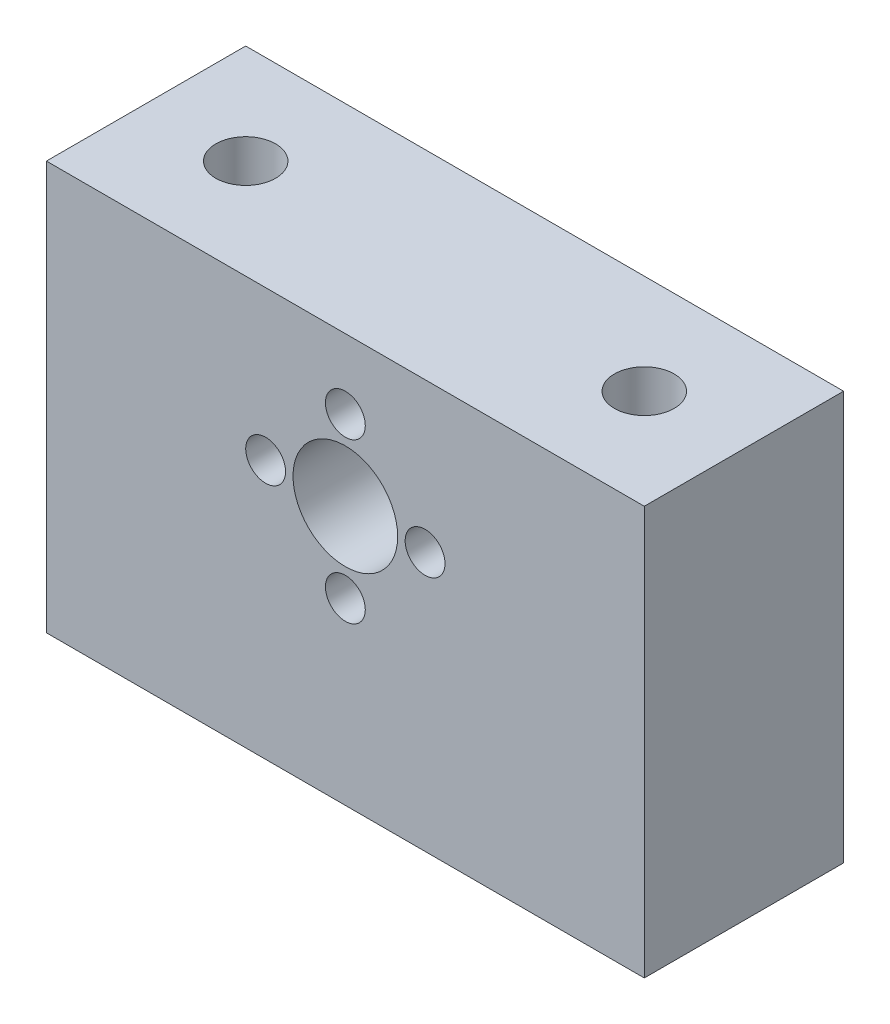
ISO-10303-21;
HEADER;
FILE_DESCRIPTION(('STEP AP214'),'2;1');
FILE_NAME('part.step','',(''),(''),'','','');
FILE_SCHEMA(('AUTOMOTIVE_DESIGN { 1 0 10303 214 1 1 1 1 }'));
ENDSEC;
DATA;
#1=APPLICATION_CONTEXT('core data for automotive mechanical design processes');
#2=APPLICATION_PROTOCOL_DEFINITION('international standard','automotive_design',2000,#1);
#3=PRODUCT_CONTEXT('',#1,'mechanical');
#4=PRODUCT('Part','Part','',(#3));
#5=PRODUCT_RELATED_PRODUCT_CATEGORY('part','',(#4));
#6=PRODUCT_DEFINITION_FORMATION('','',#4);
#7=PRODUCT_DEFINITION_CONTEXT('part definition',#1,'design');
#8=PRODUCT_DEFINITION('design','',#6,#7);
#9=PRODUCT_DEFINITION_SHAPE('','',#8);
#10=(LENGTH_UNIT() NAMED_UNIT(*) SI_UNIT(.MILLI.,.METRE.));
#11=(NAMED_UNIT(*) PLANE_ANGLE_UNIT() SI_UNIT($,.RADIAN.));
#12=(NAMED_UNIT(*) SI_UNIT($,.STERADIAN.) SOLID_ANGLE_UNIT());
#13=UNCERTAINTY_MEASURE_WITH_UNIT(LENGTH_MEASURE(1.E-05),#10,'distance_accuracy_value','');
#14=(GEOMETRIC_REPRESENTATION_CONTEXT(3) GLOBAL_UNCERTAINTY_ASSIGNED_CONTEXT((#13)) GLOBAL_UNIT_ASSIGNED_CONTEXT((#10,
#11,#12)) REPRESENTATION_CONTEXT('',''));
#15=CARTESIAN_POINT('',(0.,0.,0.));
#16=DIRECTION('',(0.,0.,1.));
#17=DIRECTION('',(1.,0.,0.));
#18=AXIS2_PLACEMENT_3D('',#15,#16,#17);
#19=CARTESIAN_POINT('',(0.,0.,20.));
#20=DIRECTION('',(0.,0.,-1.));
#21=DIRECTION('',(-1.,0.,0.));
#22=AXIS2_PLACEMENT_3D('',#19,#20,#21);
#23=PLANE('',#22);
#24=DIRECTION('',(0.,1.,0.));
#25=VECTOR('',#24,1.);
#26=CARTESIAN_POINT('',(30.0000000000366,-26.,20.));
#27=LINE('',#26,#25);
#28=CARTESIAN_POINT('',(30.0000000000366,-26.,20.));
#29=VERTEX_POINT('',#28);
#30=CARTESIAN_POINT('',(30.0000000000366,15.,20.));
#31=VERTEX_POINT('',#30);
#32=EDGE_CURVE('E85',#29,#31,#27,.T.);
#33=ORIENTED_EDGE('',*,*,#32,.T.);
#34=DIRECTION('',(-1.,0.,0.));
#35=VECTOR('',#34,1.);
#36=CARTESIAN_POINT('',(-29.9999999999634,15.,20.));
#37=LINE('',#36,#35);
#38=CARTESIAN_POINT('',(-29.9999999999634,15.,20.));
#39=VERTEX_POINT('',#38);
#40=EDGE_CURVE('E80',#31,#39,#37,.T.);
#41=ORIENTED_EDGE('',*,*,#40,.T.);
#42=DIRECTION('',(0.,-1.,0.));
#43=VECTOR('',#42,1.);
#44=CARTESIAN_POINT('',(-29.9999999999634,-26.,20.));
#45=LINE('',#44,#43);
#46=CARTESIAN_POINT('',(-29.9999999999634,-26.,20.));
#47=VERTEX_POINT('',#46);
#48=EDGE_CURVE('E83',#39,#47,#45,.T.);
#49=ORIENTED_EDGE('',*,*,#48,.T.);
#50=DIRECTION('',(1.,0.,0.));
#51=VECTOR('',#50,1.);
#52=CARTESIAN_POINT('',(-29.9999999999634,-26.,20.));
#53=LINE('',#52,#51);
#54=EDGE_CURVE('E50',#47,#29,#53,.T.);
#55=ORIENTED_EDGE('',*,*,#54,.T.);
#56=EDGE_LOOP('',(#33,#41,#49,#55));
#57=FACE_BOUND('',#56,.T.);
#58=CARTESIAN_POINT('',(0.,0.,20.));
#59=DIRECTION('',(0.,0.,1.));
#60=DIRECTION('',(1.,0.,0.));
#61=AXIS2_PLACEMENT_3D('',#58,#59,#60);
#62=CIRCLE('',#61,5.25);
#63=CARTESIAN_POINT('',(5.25,0.,20.));
#64=VERTEX_POINT('',#63);
#65=EDGE_CURVE('E100',#64,#64,#62,.T.);
#66=ORIENTED_EDGE('',*,*,#65,.F.);
#67=EDGE_LOOP('',(#66));
#68=FACE_BOUND('',#67,.T.);
#69=CARTESIAN_POINT('',(0.,8.,20.));
#70=DIRECTION('',(0.,0.,1.));
#71=DIRECTION('',(1.,0.,0.));
#72=AXIS2_PLACEMENT_3D('',#69,#70,#71);
#73=CIRCLE('',#72,2.);
#74=CARTESIAN_POINT('',(2.,8.,20.));
#75=VERTEX_POINT('',#74);
#76=EDGE_CURVE('E115',#75,#75,#73,.T.);
#77=ORIENTED_EDGE('',*,*,#76,.F.);
#78=EDGE_LOOP('',(#77));
#79=FACE_BOUND('',#78,.T.);
#80=CARTESIAN_POINT('',(8.,0.,20.));
#81=DIRECTION('',(0.,0.,1.));
#82=DIRECTION('',(1.,0.,0.));
#83=AXIS2_PLACEMENT_3D('',#80,#81,#82);
#84=CIRCLE('',#83,2.);
#85=CARTESIAN_POINT('',(10.,0.,20.));
#86=VERTEX_POINT('',#85);
#87=EDGE_CURVE('E121',#86,#86,#84,.T.);
#88=ORIENTED_EDGE('',*,*,#87,.F.);
#89=EDGE_LOOP('',(#88));
#90=FACE_BOUND('',#89,.T.);
#91=CARTESIAN_POINT('',(0.,-8.,20.));
#92=DIRECTION('',(0.,0.,1.));
#93=DIRECTION('',(1.,0.,0.));
#94=AXIS2_PLACEMENT_3D('',#91,#92,#93);
#95=CIRCLE('',#94,2.);
#96=CARTESIAN_POINT('',(1.99999999999994,-8.,20.));
#97=VERTEX_POINT('',#96);
#98=EDGE_CURVE('E127',#97,#97,#95,.T.);
#99=ORIENTED_EDGE('',*,*,#98,.F.);
#100=EDGE_LOOP('',(#99));
#101=FACE_BOUND('',#100,.T.);
#102=CARTESIAN_POINT('',(-8.,0.,20.));
#103=DIRECTION('',(0.,0.,1.));
#104=DIRECTION('',(1.,0.,0.));
#105=AXIS2_PLACEMENT_3D('',#102,#103,#104);
#106=CIRCLE('',#105,2.);
#107=CARTESIAN_POINT('',(-6.,0.,20.));
#108=VERTEX_POINT('',#107);
#109=EDGE_CURVE('E133',#108,#108,#106,.T.);
#110=ORIENTED_EDGE('',*,*,#109,.F.);
#111=EDGE_LOOP('',(#110));
#112=FACE_BOUND('',#111,.T.);
#113=ADVANCED_FACE('F33',(#57,#68,#79,#90,#101,#112),#23,.F.);
#114=CARTESIAN_POINT('',(0.,0.,0.));
#115=DIRECTION('',(0.,0.,-1.));
#116=DIRECTION('',(-1.,0.,0.));
#117=AXIS2_PLACEMENT_3D('',#114,#115,#116);
#118=PLANE('',#117);
#119=CARTESIAN_POINT('',(0.,-8.,0.));
#120=DIRECTION('',(0.,0.,1.));
#121=DIRECTION('',(1.,0.,0.));
#122=AXIS2_PLACEMENT_3D('',#119,#120,#121);
#123=CIRCLE('',#122,2.);
#124=CARTESIAN_POINT('',(1.99999999999994,-8.,0.));
#125=VERTEX_POINT('',#124);
#126=EDGE_CURVE('E130',#125,#125,#123,.T.);
#127=ORIENTED_EDGE('',*,*,#126,.T.);
#128=EDGE_LOOP('',(#127));
#129=FACE_BOUND('',#128,.T.);
#130=CARTESIAN_POINT('',(0.,8.,0.));
#131=DIRECTION('',(0.,0.,1.));
#132=DIRECTION('',(1.,0.,0.));
#133=AXIS2_PLACEMENT_3D('',#130,#131,#132);
#134=CIRCLE('',#133,2.);
#135=CARTESIAN_POINT('',(2.,8.,0.));
#136=VERTEX_POINT('',#135);
#137=EDGE_CURVE('E118',#136,#136,#134,.T.);
#138=ORIENTED_EDGE('',*,*,#137,.T.);
#139=EDGE_LOOP('',(#138));
#140=FACE_BOUND('',#139,.T.);
#141=DIRECTION('',(0.,1.,0.));
#142=VECTOR('',#141,1.);
#143=CARTESIAN_POINT('',(30.0000000000366,-26.,0.));
#144=LINE('',#143,#142);
#145=CARTESIAN_POINT('',(30.0000000000366,-26.,0.));
#146=VERTEX_POINT('',#145);
#147=CARTESIAN_POINT('',(30.0000000000366,15.,0.));
#148=VERTEX_POINT('',#147);
#149=EDGE_CURVE('E97',#146,#148,#144,.T.);
#150=ORIENTED_EDGE('',*,*,#149,.F.);
#151=DIRECTION('',(1.,0.,0.));
#152=VECTOR('',#151,1.);
#153=CARTESIAN_POINT('',(-29.9999999999634,-26.,0.));
#154=LINE('',#153,#152);
#155=CARTESIAN_POINT('',(-29.9999999999634,-26.,0.));
#156=VERTEX_POINT('',#155);
#157=EDGE_CURVE('E73',#156,#146,#154,.T.);
#158=ORIENTED_EDGE('',*,*,#157,.F.);
#159=DIRECTION('',(0.,-1.,0.));
#160=VECTOR('',#159,1.);
#161=CARTESIAN_POINT('',(-29.9999999999634,-26.,0.));
#162=LINE('',#161,#160);
#163=CARTESIAN_POINT('',(-29.9999999999634,15.,0.));
#164=VERTEX_POINT('',#163);
#165=EDGE_CURVE('E67',#164,#156,#162,.T.);
#166=ORIENTED_EDGE('',*,*,#165,.F.);
#167=DIRECTION('',(-1.,0.,0.));
#168=VECTOR('',#167,1.);
#169=CARTESIAN_POINT('',(-29.9999999999634,15.,0.));
#170=LINE('',#169,#168);
#171=EDGE_CURVE('E89',#148,#164,#170,.T.);
#172=ORIENTED_EDGE('',*,*,#171,.F.);
#173=EDGE_LOOP('',(#150,#158,#166,#172));
#174=FACE_BOUND('',#173,.T.);
#175=CARTESIAN_POINT('',(0.,0.,0.));
#176=DIRECTION('',(0.,0.,1.));
#177=DIRECTION('',(1.,0.,0.));
#178=AXIS2_PLACEMENT_3D('',#175,#176,#177);
#179=CIRCLE('',#178,5.25);
#180=CARTESIAN_POINT('',(5.25,0.,0.));
#181=VERTEX_POINT('',#180);
#182=EDGE_CURVE('E112',#181,#181,#179,.T.);
#183=ORIENTED_EDGE('',*,*,#182,.T.);
#184=EDGE_LOOP('',(#183));
#185=FACE_BOUND('',#184,.T.);
#186=CARTESIAN_POINT('',(8.,0.,0.));
#187=DIRECTION('',(0.,0.,1.));
#188=DIRECTION('',(1.,0.,0.));
#189=AXIS2_PLACEMENT_3D('',#186,#187,#188);
#190=CIRCLE('',#189,2.);
#191=CARTESIAN_POINT('',(10.,0.,0.));
#192=VERTEX_POINT('',#191);
#193=EDGE_CURVE('E124',#192,#192,#190,.T.);
#194=ORIENTED_EDGE('',*,*,#193,.T.);
#195=EDGE_LOOP('',(#194));
#196=FACE_BOUND('',#195,.T.);
#197=CARTESIAN_POINT('',(-8.,0.,0.));
#198=DIRECTION('',(0.,0.,1.));
#199=DIRECTION('',(1.,0.,0.));
#200=AXIS2_PLACEMENT_3D('',#197,#198,#199);
#201=CIRCLE('',#200,2.);
#202=CARTESIAN_POINT('',(-6.,0.,0.));
#203=VERTEX_POINT('',#202);
#204=EDGE_CURVE('E136',#203,#203,#201,.T.);
#205=ORIENTED_EDGE('',*,*,#204,.T.);
#206=EDGE_LOOP('',(#205));
#207=FACE_BOUND('',#206,.T.);
#208=ADVANCED_FACE('F108',(#129,#140,#174,#185,#196,#207),#118,.T.);
#209=CARTESIAN_POINT('',(30.0000000000366,-26.,20.));
#210=DIRECTION('',(-1.,0.,0.));
#211=DIRECTION('',(0.,0.,1.));
#212=AXIS2_PLACEMENT_3D('',#209,#210,#211);
#213=PLANE('',#212);
#214=ORIENTED_EDGE('',*,*,#149,.T.);
#215=DIRECTION('',(0.,0.,-1.));
#216=VECTOR('',#215,1.);
#217=CARTESIAN_POINT('',(30.0000000000366,15.,20.));
#218=LINE('',#217,#216);
#219=EDGE_CURVE('E11',#31,#148,#218,.T.);
#220=ORIENTED_EDGE('',*,*,#219,.F.);
#221=ORIENTED_EDGE('',*,*,#32,.F.);
#222=DIRECTION('',(0.,0.,-1.));
#223=VECTOR('',#222,1.);
#224=CARTESIAN_POINT('',(30.0000000000366,-26.,20.));
#225=LINE('',#224,#223);
#226=EDGE_CURVE('E93',#29,#146,#225,.T.);
#227=ORIENTED_EDGE('',*,*,#226,.T.);
#228=EDGE_LOOP('',(#214,#220,#221,#227));
#229=FACE_BOUND('',#228,.T.);
#230=ADVANCED_FACE('F35',(#229),#213,.F.);
#231=CARTESIAN_POINT('',(-29.9999999999634,15.,20.));
#232=DIRECTION('',(0.,-1.,0.));
#233=DIRECTION('',(1.,0.,0.));
#234=AXIS2_PLACEMENT_3D('',#231,#232,#233);
#235=PLANE('',#234);
#236=CARTESIAN_POINT('',(-20.,15.,10.));
#237=DIRECTION('',(0.,1.,0.));
#238=DIRECTION('',(0.,0.,1.));
#239=AXIS2_PLACEMENT_3D('',#236,#237,#238);
#240=CIRCLE('',#239,3.);
#241=CARTESIAN_POINT('',(-20.,15.,13.));
#242=VERTEX_POINT('',#241);
#243=EDGE_CURVE('E148',#242,#242,#240,.T.);
#244=ORIENTED_EDGE('',*,*,#243,.F.);
#245=EDGE_LOOP('',(#244));
#246=FACE_BOUND('',#245,.T.);
#247=CARTESIAN_POINT('',(20.0000000000001,15.,9.99999999999978));
#248=DIRECTION('',(0.,1.,0.));
#249=DIRECTION('',(0.,0.,-1.));
#250=AXIS2_PLACEMENT_3D('',#247,#248,#249);
#251=CIRCLE('',#250,3.00000000000001);
#252=CARTESIAN_POINT('',(20.0000000000001,15.,6.99999999999977));
#253=VERTEX_POINT('',#252);
#254=EDGE_CURVE('E142',#253,#253,#251,.T.);
#255=ORIENTED_EDGE('',*,*,#254,.F.);
#256=EDGE_LOOP('',(#255));
#257=FACE_BOUND('',#256,.T.);
#258=ORIENTED_EDGE('',*,*,#171,.T.);
#259=DIRECTION('',(0.,0.,-1.));
#260=VECTOR('',#259,1.);
#261=CARTESIAN_POINT('',(-29.9999999999634,15.,20.));
#262=LINE('',#261,#260);
#263=EDGE_CURVE('E42',#39,#164,#262,.T.);
#264=ORIENTED_EDGE('',*,*,#263,.F.);
#265=ORIENTED_EDGE('',*,*,#40,.F.);
#266=ORIENTED_EDGE('',*,*,#219,.T.);
#267=EDGE_LOOP('',(#258,#264,#265,#266));
#268=FACE_BOUND('',#267,.T.);
#269=ADVANCED_FACE('F88',(#246,#257,#268),#235,.F.);
#270=CARTESIAN_POINT('',(-29.9999999999634,-26.,20.));
#271=DIRECTION('',(1.,0.,0.));
#272=DIRECTION('',(0.,0.,-1.));
#273=AXIS2_PLACEMENT_3D('',#270,#271,#272);
#274=PLANE('',#273);
#275=ORIENTED_EDGE('',*,*,#165,.T.);
#276=DIRECTION('',(0.,0.,-1.));
#277=VECTOR('',#276,1.);
#278=CARTESIAN_POINT('',(-29.9999999999634,-26.,20.));
#279=LINE('',#278,#277);
#280=EDGE_CURVE('E90',#47,#156,#279,.T.);
#281=ORIENTED_EDGE('',*,*,#280,.F.);
#282=ORIENTED_EDGE('',*,*,#48,.F.);
#283=ORIENTED_EDGE('',*,*,#263,.T.);
#284=EDGE_LOOP('',(#275,#281,#282,#283));
#285=FACE_BOUND('',#284,.T.);
#286=ADVANCED_FACE('F91',(#285),#274,.F.);
#287=CARTESIAN_POINT('',(-29.9999999999634,-26.,20.));
#288=DIRECTION('',(0.,1.,0.));
#289=DIRECTION('',(-1.,0.,0.));
#290=AXIS2_PLACEMENT_3D('',#287,#288,#289);
#291=PLANE('',#290);
#292=CARTESIAN_POINT('',(-20.,-26.,10.));
#293=DIRECTION('',(0.,1.,0.));
#294=DIRECTION('',(0.,0.,1.));
#295=AXIS2_PLACEMENT_3D('',#292,#293,#294);
#296=CIRCLE('',#295,3.);
#297=CARTESIAN_POINT('',(-20.,-26.,13.));
#298=VERTEX_POINT('',#297);
#299=EDGE_CURVE('E139',#298,#298,#296,.T.);
#300=ORIENTED_EDGE('',*,*,#299,.T.);
#301=EDGE_LOOP('',(#300));
#302=FACE_BOUND('',#301,.T.);
#303=CARTESIAN_POINT('',(20.0000000000001,-26.,9.99999999999978));
#304=DIRECTION('',(0.,1.,0.));
#305=DIRECTION('',(0.,0.,-1.));
#306=AXIS2_PLACEMENT_3D('',#303,#304,#305);
#307=CIRCLE('',#306,3.00000000000001);
#308=CARTESIAN_POINT('',(20.0000000000001,-26.,6.99999999999977));
#309=VERTEX_POINT('',#308);
#310=EDGE_CURVE('E145',#309,#309,#307,.T.);
#311=ORIENTED_EDGE('',*,*,#310,.T.);
#312=EDGE_LOOP('',(#311));
#313=FACE_BOUND('',#312,.T.);
#314=ORIENTED_EDGE('',*,*,#157,.T.);
#315=ORIENTED_EDGE('',*,*,#226,.F.);
#316=ORIENTED_EDGE('',*,*,#54,.F.);
#317=ORIENTED_EDGE('',*,*,#280,.T.);
#318=EDGE_LOOP('',(#314,#315,#316,#317));
#319=FACE_BOUND('',#318,.T.);
#320=ADVANCED_FACE('F105',(#302,#313,#319),#291,.F.);
#321=CARTESIAN_POINT('',(0.,0.,20.));
#322=DIRECTION('',(0.,0.,-1.));
#323=DIRECTION('',(-1.,0.,0.));
#324=AXIS2_PLACEMENT_3D('',#321,#322,#323);
#325=CYLINDRICAL_SURFACE('',#324,5.25);
#326=ORIENTED_EDGE('',*,*,#65,.T.);
#327=EDGE_LOOP('',(#326));
#328=FACE_BOUND('',#327,.T.);
#329=ORIENTED_EDGE('',*,*,#182,.F.);
#330=EDGE_LOOP('',(#329));
#331=FACE_BOUND('',#330,.T.);
#332=ADVANCED_FACE('F186',(#328,#331),#325,.F.);
#333=CARTESIAN_POINT('',(0.,8.,20.));
#334=DIRECTION('',(0.,0.,-1.));
#335=DIRECTION('',(-1.,0.,0.));
#336=AXIS2_PLACEMENT_3D('',#333,#334,#335);
#337=CYLINDRICAL_SURFACE('',#336,2.);
#338=ORIENTED_EDGE('',*,*,#76,.T.);
#339=EDGE_LOOP('',(#338));
#340=FACE_BOUND('',#339,.T.);
#341=ORIENTED_EDGE('',*,*,#137,.F.);
#342=EDGE_LOOP('',(#341));
#343=FACE_BOUND('',#342,.T.);
#344=ADVANCED_FACE('F208',(#340,#343),#337,.F.);
#345=CARTESIAN_POINT('',(8.,0.,20.));
#346=DIRECTION('',(0.,0.,-1.));
#347=DIRECTION('',(-1.,0.,0.));
#348=AXIS2_PLACEMENT_3D('',#345,#346,#347);
#349=CYLINDRICAL_SURFACE('',#348,2.);
#350=ORIENTED_EDGE('',*,*,#87,.T.);
#351=EDGE_LOOP('',(#350));
#352=FACE_BOUND('',#351,.T.);
#353=ORIENTED_EDGE('',*,*,#193,.F.);
#354=EDGE_LOOP('',(#353));
#355=FACE_BOUND('',#354,.T.);
#356=ADVANCED_FACE('F215',(#352,#355),#349,.F.);
#357=CARTESIAN_POINT('',(0.,-8.,20.));
#358=DIRECTION('',(0.,0.,-1.));
#359=DIRECTION('',(-1.,0.,0.));
#360=AXIS2_PLACEMENT_3D('',#357,#358,#359);
#361=CYLINDRICAL_SURFACE('',#360,2.);
#362=ORIENTED_EDGE('',*,*,#98,.T.);
#363=EDGE_LOOP('',(#362));
#364=FACE_BOUND('',#363,.T.);
#365=ORIENTED_EDGE('',*,*,#126,.F.);
#366=EDGE_LOOP('',(#365));
#367=FACE_BOUND('',#366,.T.);
#368=ADVANCED_FACE('F174',(#364,#367),#361,.F.);
#369=CARTESIAN_POINT('',(-8.,0.,20.));
#370=DIRECTION('',(0.,0.,-1.));
#371=DIRECTION('',(-1.,0.,0.));
#372=AXIS2_PLACEMENT_3D('',#369,#370,#371);
#373=CYLINDRICAL_SURFACE('',#372,2.);
#374=ORIENTED_EDGE('',*,*,#109,.T.);
#375=EDGE_LOOP('',(#374));
#376=FACE_BOUND('',#375,.T.);
#377=ORIENTED_EDGE('',*,*,#204,.F.);
#378=EDGE_LOOP('',(#377));
#379=FACE_BOUND('',#378,.T.);
#380=ADVANCED_FACE('F168',(#376,#379),#373,.F.);
#381=CARTESIAN_POINT('',(20.0000000000001,-26.,9.99999999999978));
#382=DIRECTION('',(0.,1.,0.));
#383=DIRECTION('',(0.,0.,1.));
#384=AXIS2_PLACEMENT_3D('',#381,#382,#383);
#385=CYLINDRICAL_SURFACE('',#384,3.00000000000001);
#386=ORIENTED_EDGE('',*,*,#310,.F.);
#387=EDGE_LOOP('',(#386));
#388=FACE_BOUND('',#387,.T.);
#389=ORIENTED_EDGE('',*,*,#254,.T.);
#390=EDGE_LOOP('',(#389));
#391=FACE_BOUND('',#390,.T.);
#392=ADVANCED_FACE('F159',(#388,#391),#385,.F.);
#393=CARTESIAN_POINT('',(-20.,-26.,10.));
#394=DIRECTION('',(0.,1.,0.));
#395=DIRECTION('',(0.,0.,1.));
#396=AXIS2_PLACEMENT_3D('',#393,#394,#395);
#397=CYLINDRICAL_SURFACE('',#396,3.);
#398=ORIENTED_EDGE('',*,*,#299,.F.);
#399=EDGE_LOOP('',(#398));
#400=FACE_BOUND('',#399,.T.);
#401=ORIENTED_EDGE('',*,*,#243,.T.);
#402=EDGE_LOOP('',(#401));
#403=FACE_BOUND('',#402,.T.);
#404=ADVANCED_FACE('F156',(#400,#403),#397,.F.);
#405=CLOSED_SHELL('',(#113,#208,#230,#269,#286,#320,#332,#344,#356,#368,#380,#392,#404));
#406=MANIFOLD_SOLID_BREP('B2',#405);
#407=ADVANCED_BREP_SHAPE_REPRESENTATION('',(#18,#406),#14);
#408=SHAPE_DEFINITION_REPRESENTATION(#9,#407);
ENDSEC;
END-ISO-10303-21;
